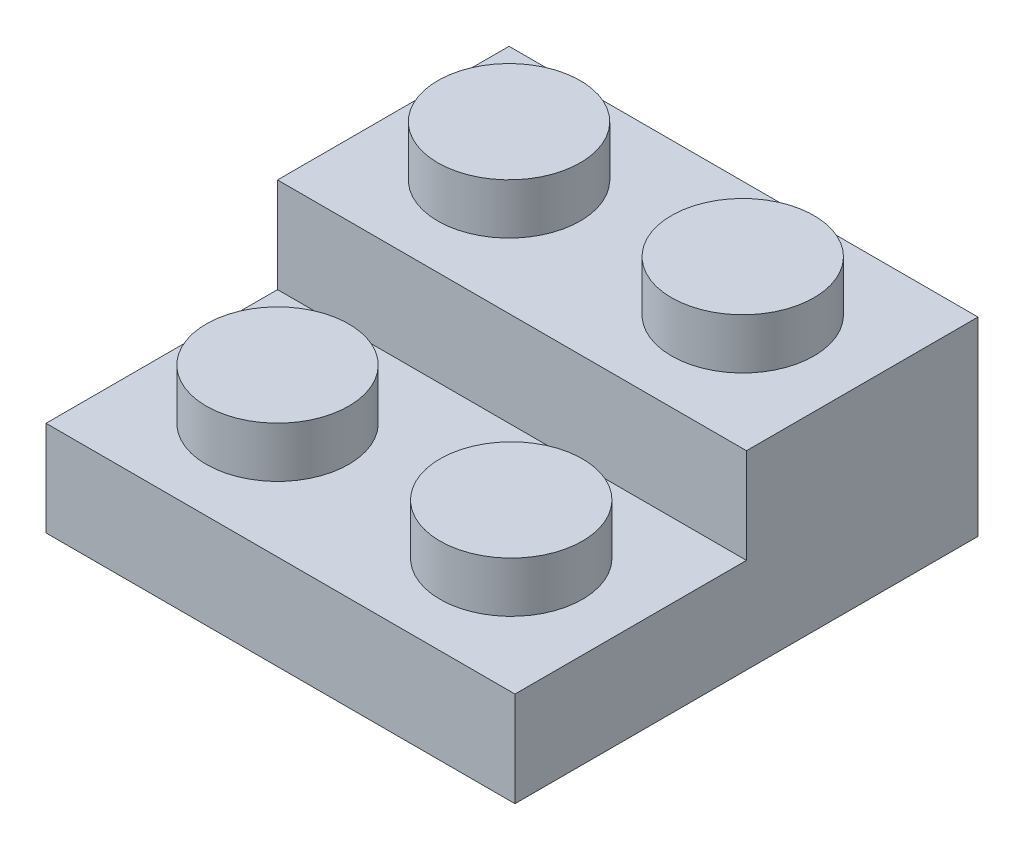
ISO-10303-21;
HEADER;
FILE_DESCRIPTION(('STEP AP214'),'2;1');
FILE_NAME('part.step','',(''),(''),'','','');
FILE_SCHEMA(('AUTOMOTIVE_DESIGN { 1 0 10303 214 1 1 1 1 }'));
ENDSEC;
DATA;
#1=APPLICATION_CONTEXT('core data for automotive mechanical design processes');
#2=APPLICATION_PROTOCOL_DEFINITION('international standard','automotive_design',2000,#1);
#3=PRODUCT_CONTEXT('',#1,'mechanical');
#4=PRODUCT('Part','Part','',(#3));
#5=PRODUCT_RELATED_PRODUCT_CATEGORY('part','',(#4));
#6=PRODUCT_DEFINITION_FORMATION('','',#4);
#7=PRODUCT_DEFINITION_CONTEXT('part definition',#1,'design');
#8=PRODUCT_DEFINITION('design','',#6,#7);
#9=PRODUCT_DEFINITION_SHAPE('','',#8);
#10=(LENGTH_UNIT() NAMED_UNIT(*) SI_UNIT(.MILLI.,.METRE.));
#11=(NAMED_UNIT(*) PLANE_ANGLE_UNIT() SI_UNIT($,.RADIAN.));
#12=(NAMED_UNIT(*) SI_UNIT($,.STERADIAN.) SOLID_ANGLE_UNIT());
#13=UNCERTAINTY_MEASURE_WITH_UNIT(LENGTH_MEASURE(1.E-05),#10,'distance_accuracy_value','');
#14=(GEOMETRIC_REPRESENTATION_CONTEXT(3) GLOBAL_UNCERTAINTY_ASSIGNED_CONTEXT((#13)) GLOBAL_UNIT_ASSIGNED_CONTEXT((#10,
#11,#12)) REPRESENTATION_CONTEXT('',''));
#15=CARTESIAN_POINT('',(0.,0.,0.));
#16=DIRECTION('',(0.,0.,1.));
#17=DIRECTION('',(1.,0.,0.));
#18=AXIS2_PLACEMENT_3D('',#15,#16,#17);
#19=CARTESIAN_POINT('',(-7.9,6.4,7.80000002100001));
#20=DIRECTION('',(1.,0.,0.));
#21=DIRECTION('',(0.,0.,-1.));
#22=AXIS2_PLACEMENT_3D('',#19,#20,#21);
#23=PLANE('',#22);
#24=DIRECTION('',(0.,1.,0.));
#25=VECTOR('',#24,1.);
#26=CARTESIAN_POINT('',(-7.9,3.2,0.));
#27=LINE('',#26,#25);
#28=CARTESIAN_POINT('',(-7.9,3.2,0.));
#29=VERTEX_POINT('',#28);
#30=CARTESIAN_POINT('',(-7.9,6.4,0.));
#31=VERTEX_POINT('',#30);
#32=EDGE_CURVE('E99',#29,#31,#27,.T.);
#33=ORIENTED_EDGE('',*,*,#32,.T.);
#34=DIRECTION('',(0.,0.,1.));
#35=VECTOR('',#34,1.);
#36=CARTESIAN_POINT('',(-7.9,6.4,7.80000002100001));
#37=LINE('',#36,#35);
#38=CARTESIAN_POINT('',(-7.9,6.4,-7.80000002099998));
#39=VERTEX_POINT('',#38);
#40=EDGE_CURVE('E84',#39,#31,#37,.T.);
#41=ORIENTED_EDGE('',*,*,#40,.F.);
#42=DIRECTION('',(0.,-1.,0.));
#43=VECTOR('',#42,1.);
#44=CARTESIAN_POINT('',(-7.9,6.4,-7.80000002099998));
#45=LINE('',#44,#43);
#46=CARTESIAN_POINT('',(-7.9,0.,-7.80000002099998));
#47=VERTEX_POINT('',#46);
#48=EDGE_CURVE('E77',#39,#47,#45,.T.);
#49=ORIENTED_EDGE('',*,*,#48,.T.);
#50=DIRECTION('',(0.,0.,1.));
#51=VECTOR('',#50,1.);
#52=CARTESIAN_POINT('',(-7.9,0.,7.80000002100001));
#53=LINE('',#52,#51);
#54=CARTESIAN_POINT('',(-7.9,0.,7.80000002100001));
#55=VERTEX_POINT('',#54);
#56=EDGE_CURVE('E91',#47,#55,#53,.T.);
#57=ORIENTED_EDGE('',*,*,#56,.T.);
#58=DIRECTION('',(0.,-1.,0.));
#59=VECTOR('',#58,1.);
#60=CARTESIAN_POINT('',(-7.9,6.4,7.80000002100001));
#61=LINE('',#60,#59);
#62=CARTESIAN_POINT('',(-7.9,3.2,7.80000002100001));
#63=VERTEX_POINT('',#62);
#64=EDGE_CURVE('E11',#63,#55,#61,.T.);
#65=ORIENTED_EDGE('',*,*,#64,.F.);
#66=DIRECTION('',(0.,0.,1.));
#67=VECTOR('',#66,1.);
#68=CARTESIAN_POINT('',(-7.9,3.2,0.));
#69=LINE('',#68,#67);
#70=EDGE_CURVE('E121',#29,#63,#69,.T.);
#71=ORIENTED_EDGE('',*,*,#70,.F.);
#72=EDGE_LOOP('',(#33,#41,#49,#57,#65,#71));
#73=FACE_BOUND('',#72,.T.);
#74=ADVANCED_FACE('F33',(#73),#23,.F.);
#75=CARTESIAN_POINT('',(7.9,6.4,7.80000002100001));
#76=DIRECTION('',(0.,0.,-1.));
#77=DIRECTION('',(-1.,0.,0.));
#78=AXIS2_PLACEMENT_3D('',#75,#76,#77);
#79=PLANE('',#78);
#80=DIRECTION('',(1.,0.,0.));
#81=VECTOR('',#80,1.);
#82=CARTESIAN_POINT('',(0.,3.2,7.80000002100001));
#83=LINE('',#82,#81);
#84=CARTESIAN_POINT('',(7.9,3.2,7.80000002100001));
#85=VERTEX_POINT('',#84);
#86=EDGE_CURVE('E117',#63,#85,#83,.T.);
#87=ORIENTED_EDGE('',*,*,#86,.F.);
#88=ORIENTED_EDGE('',*,*,#64,.T.);
#89=DIRECTION('',(1.,0.,0.));
#90=VECTOR('',#89,1.);
#91=CARTESIAN_POINT('',(7.9,0.,7.80000002100001));
#92=LINE('',#91,#90);
#93=CARTESIAN_POINT('',(7.9,0.,7.80000002100001));
#94=VERTEX_POINT('',#93);
#95=EDGE_CURVE('E96',#55,#94,#92,.T.);
#96=ORIENTED_EDGE('',*,*,#95,.T.);
#97=DIRECTION('',(0.,-1.,0.));
#98=VECTOR('',#97,1.);
#99=CARTESIAN_POINT('',(7.9,6.4,7.80000002100001));
#100=LINE('',#99,#98);
#101=EDGE_CURVE('E40',#85,#94,#100,.T.);
#102=ORIENTED_EDGE('',*,*,#101,.F.);
#103=EDGE_LOOP('',(#87,#88,#96,#102));
#104=FACE_BOUND('',#103,.T.);
#105=ADVANCED_FACE('F114',(#104),#79,.F.);
#106=CARTESIAN_POINT('',(7.9,6.4,7.80000002100001));
#107=DIRECTION('',(-1.,0.,0.));
#108=DIRECTION('',(0.,0.,1.));
#109=AXIS2_PLACEMENT_3D('',#106,#107,#108);
#110=PLANE('',#109);
#111=DIRECTION('',(0.,1.,0.));
#112=VECTOR('',#111,1.);
#113=CARTESIAN_POINT('',(7.9,3.2,0.));
#114=LINE('',#113,#112);
#115=CARTESIAN_POINT('',(7.9,3.2,0.));
#116=VERTEX_POINT('',#115);
#117=CARTESIAN_POINT('',(7.9,6.4,0.));
#118=VERTEX_POINT('',#117);
#119=EDGE_CURVE('E47',#116,#118,#114,.T.);
#120=ORIENTED_EDGE('',*,*,#119,.F.);
#121=DIRECTION('',(0.,0.,-1.));
#122=VECTOR('',#121,1.);
#123=CARTESIAN_POINT('',(7.9,3.2,0.));
#124=LINE('',#123,#122);
#125=EDGE_CURVE('E111',#85,#116,#124,.T.);
#126=ORIENTED_EDGE('',*,*,#125,.F.);
#127=ORIENTED_EDGE('',*,*,#101,.T.);
#128=DIRECTION('',(0.,0.,-1.));
#129=VECTOR('',#128,1.);
#130=CARTESIAN_POINT('',(7.9,0.,7.80000002100001));
#131=LINE('',#130,#129);
#132=CARTESIAN_POINT('',(7.9,0.,-7.80000002099998));
#133=VERTEX_POINT('',#132);
#134=EDGE_CURVE('E85',#94,#133,#131,.T.);
#135=ORIENTED_EDGE('',*,*,#134,.T.);
#136=DIRECTION('',(0.,-1.,0.));
#137=VECTOR('',#136,1.);
#138=CARTESIAN_POINT('',(7.9,6.4,-7.80000002099998));
#139=LINE('',#138,#137);
#140=CARTESIAN_POINT('',(7.9,6.4,-7.80000002099998));
#141=VERTEX_POINT('',#140);
#142=EDGE_CURVE('E80',#141,#133,#139,.T.);
#143=ORIENTED_EDGE('',*,*,#142,.F.);
#144=DIRECTION('',(0.,0.,-1.));
#145=VECTOR('',#144,1.);
#146=CARTESIAN_POINT('',(7.9,6.4,7.80000002100001));
#147=LINE('',#146,#145);
#148=EDGE_CURVE('E138',#118,#141,#147,.T.);
#149=ORIENTED_EDGE('',*,*,#148,.F.);
#150=EDGE_LOOP('',(#120,#126,#127,#135,#143,#149));
#151=FACE_BOUND('',#150,.T.);
#152=ADVANCED_FACE('F108',(#151),#110,.F.);
#153=CARTESIAN_POINT('',(0.,6.4,0.));
#154=DIRECTION('',(0.,1.,0.));
#155=DIRECTION('',(0.,0.,1.));
#156=AXIS2_PLACEMENT_3D('',#153,#154,#155);
#157=PLANE('',#156);
#158=CARTESIAN_POINT('',(-4.,6.4,-3.90000002099998));
#159=DIRECTION('',(0.,1.,0.));
#160=DIRECTION('',(0.,0.,1.));
#161=AXIS2_PLACEMENT_3D('',#158,#159,#160);
#162=CIRCLE('',#161,2.4);
#163=CARTESIAN_POINT('',(-4.,6.4,-1.50000002099998));
#164=VERTEX_POINT('',#163);
#165=EDGE_CURVE('E163',#164,#164,#162,.T.);
#166=ORIENTED_EDGE('',*,*,#165,.F.);
#167=EDGE_LOOP('',(#166));
#168=FACE_BOUND('',#167,.T.);
#169=CARTESIAN_POINT('',(3.874,6.4,-3.90000002099998));
#170=DIRECTION('',(0.,1.,0.));
#171=DIRECTION('',(0.,0.,1.));
#172=AXIS2_PLACEMENT_3D('',#169,#170,#171);
#173=CIRCLE('',#172,2.4);
#174=CARTESIAN_POINT('',(3.874,6.4,-1.50000002099998));
#175=VERTEX_POINT('',#174);
#176=EDGE_CURVE('E157',#175,#175,#173,.T.);
#177=ORIENTED_EDGE('',*,*,#176,.F.);
#178=EDGE_LOOP('',(#177));
#179=FACE_BOUND('',#178,.T.);
#180=ORIENTED_EDGE('',*,*,#40,.T.);
#181=DIRECTION('',(1.,0.,0.));
#182=VECTOR('',#181,1.);
#183=CARTESIAN_POINT('',(0.,6.4,0.));
#184=LINE('',#183,#182);
#185=EDGE_CURVE('E130',#31,#118,#184,.T.);
#186=ORIENTED_EDGE('',*,*,#185,.T.);
#187=ORIENTED_EDGE('',*,*,#148,.T.);
#188=DIRECTION('',(-1.,0.,0.));
#189=VECTOR('',#188,1.);
#190=CARTESIAN_POINT('',(7.9,6.4,-7.80000002099998));
#191=LINE('',#190,#189);
#192=EDGE_CURVE('E56',#141,#39,#191,.T.);
#193=ORIENTED_EDGE('',*,*,#192,.T.);
#194=EDGE_LOOP('',(#180,#186,#187,#193));
#195=FACE_BOUND('',#194,.T.);
#196=ADVANCED_FACE('F137',(#168,#179,#195),#157,.T.);
#197=CARTESIAN_POINT('',(7.9,6.4,-7.80000002099998));
#198=DIRECTION('',(0.,0.,1.));
#199=DIRECTION('',(1.,0.,0.));
#200=AXIS2_PLACEMENT_3D('',#197,#198,#199);
#201=PLANE('',#200);
#202=DIRECTION('',(-1.,0.,0.));
#203=VECTOR('',#202,1.);
#204=CARTESIAN_POINT('',(7.9,0.,-7.80000002099998));
#205=LINE('',#204,#203);
#206=EDGE_CURVE('E74',#133,#47,#205,.T.);
#207=ORIENTED_EDGE('',*,*,#206,.T.);
#208=ORIENTED_EDGE('',*,*,#48,.F.);
#209=ORIENTED_EDGE('',*,*,#192,.F.);
#210=ORIENTED_EDGE('',*,*,#142,.T.);
#211=EDGE_LOOP('',(#207,#208,#209,#210));
#212=FACE_BOUND('',#211,.T.);
#213=ADVANCED_FACE('F76',(#212),#201,.F.);
#214=CARTESIAN_POINT('',(0.,0.,0.));
#215=DIRECTION('',(0.,1.,0.));
#216=DIRECTION('',(0.,0.,1.));
#217=AXIS2_PLACEMENT_3D('',#214,#215,#216);
#218=PLANE('',#217);
#219=CARTESIAN_POINT('',(0.,0.,-3.93454978920842));
#220=DIRECTION('',(0.,-1.,0.));
#221=DIRECTION('',(0.,0.,-1.));
#222=AXIS2_PLACEMENT_3D('',#219,#220,#221);
#223=CIRCLE('',#222,2.5);
#224=CARTESIAN_POINT('',(0.,0.,-6.43454978920842));
#225=VERTEX_POINT('',#224);
#226=EDGE_CURVE('E175',#225,#225,#223,.T.);
#227=ORIENTED_EDGE('',*,*,#226,.F.);
#228=EDGE_LOOP('',(#227));
#229=FACE_BOUND('',#228,.T.);
#230=CARTESIAN_POINT('',(0.,0.,3.90000001050001));
#231=DIRECTION('',(0.,-1.,0.));
#232=DIRECTION('',(0.,0.,-1.));
#233=AXIS2_PLACEMENT_3D('',#230,#231,#232);
#234=CIRCLE('',#233,2.5);
#235=CARTESIAN_POINT('',(0.,0.,1.40000001050001));
#236=VERTEX_POINT('',#235);
#237=EDGE_CURVE('E169',#236,#236,#234,.T.);
#238=ORIENTED_EDGE('',*,*,#237,.F.);
#239=EDGE_LOOP('',(#238));
#240=FACE_BOUND('',#239,.T.);
#241=ORIENTED_EDGE('',*,*,#56,.F.);
#242=ORIENTED_EDGE('',*,*,#206,.F.);
#243=ORIENTED_EDGE('',*,*,#134,.F.);
#244=ORIENTED_EDGE('',*,*,#95,.F.);
#245=EDGE_LOOP('',(#241,#242,#243,#244));
#246=FACE_BOUND('',#245,.T.);
#247=ADVANCED_FACE('F94',(#229,#240,#246),#218,.F.);
#248=CARTESIAN_POINT('',(0.,3.2,0.));
#249=DIRECTION('',(0.,0.,1.));
#250=DIRECTION('',(1.,0.,0.));
#251=AXIS2_PLACEMENT_3D('',#248,#249,#250);
#252=PLANE('',#251);
#253=ORIENTED_EDGE('',*,*,#185,.F.);
#254=ORIENTED_EDGE('',*,*,#32,.F.);
#255=DIRECTION('',(1.,0.,0.));
#256=VECTOR('',#255,1.);
#257=CARTESIAN_POINT('',(0.,3.2,0.));
#258=LINE('',#257,#256);
#259=EDGE_CURVE('E133',#29,#116,#258,.T.);
#260=ORIENTED_EDGE('',*,*,#259,.T.);
#261=ORIENTED_EDGE('',*,*,#119,.T.);
#262=EDGE_LOOP('',(#253,#254,#260,#261));
#263=FACE_BOUND('',#262,.T.);
#264=ADVANCED_FACE('F131',(#263),#252,.T.);
#265=CARTESIAN_POINT('',(0.,3.2,0.));
#266=DIRECTION('',(0.,1.,0.));
#267=DIRECTION('',(0.,0.,1.));
#268=AXIS2_PLACEMENT_3D('',#265,#266,#267);
#269=PLANE('',#268);
#270=CARTESIAN_POINT('',(-4.,3.2,3.90000002100001));
#271=DIRECTION('',(0.,1.,0.));
#272=DIRECTION('',(0.,0.,1.));
#273=AXIS2_PLACEMENT_3D('',#270,#271,#272);
#274=CIRCLE('',#273,2.4000000030699);
#275=CARTESIAN_POINT('',(-4.,3.2,6.30000002406991));
#276=VERTEX_POINT('',#275);
#277=EDGE_CURVE('E151',#276,#276,#274,.T.);
#278=ORIENTED_EDGE('',*,*,#277,.F.);
#279=EDGE_LOOP('',(#278));
#280=FACE_BOUND('',#279,.T.);
#281=CARTESIAN_POINT('',(3.874,3.2,3.90000002100001));
#282=DIRECTION('',(0.,1.,0.));
#283=DIRECTION('',(0.,0.,1.));
#284=AXIS2_PLACEMENT_3D('',#281,#282,#283);
#285=CIRCLE('',#284,2.4000000030699);
#286=CARTESIAN_POINT('',(3.874,3.2,6.30000002406991));
#287=VERTEX_POINT('',#286);
#288=EDGE_CURVE('E145',#287,#287,#285,.T.);
#289=ORIENTED_EDGE('',*,*,#288,.F.);
#290=EDGE_LOOP('',(#289));
#291=FACE_BOUND('',#290,.T.);
#292=ORIENTED_EDGE('',*,*,#259,.F.);
#293=ORIENTED_EDGE('',*,*,#70,.T.);
#294=ORIENTED_EDGE('',*,*,#86,.T.);
#295=ORIENTED_EDGE('',*,*,#125,.T.);
#296=EDGE_LOOP('',(#292,#293,#294,#295));
#297=FACE_BOUND('',#296,.T.);
#298=ADVANCED_FACE('F226',(#280,#291,#297),#269,.T.);
#299=CARTESIAN_POINT('',(3.874,4.9,3.90000002100001));
#300=DIRECTION('',(0.,-1.,0.));
#301=DIRECTION('',(0.,0.,-1.));
#302=AXIS2_PLACEMENT_3D('',#299,#300,#301);
#303=CYLINDRICAL_SURFACE('',#302,2.4000000030699);
#304=CARTESIAN_POINT('',(3.874,4.9,3.90000002100001));
#305=DIRECTION('',(0.,1.,0.));
#306=DIRECTION('',(0.,0.,1.));
#307=AXIS2_PLACEMENT_3D('',#304,#305,#306);
#308=CIRCLE('',#307,2.4000000030699);
#309=CARTESIAN_POINT('',(3.874,4.9,6.30000002406991));
#310=VERTEX_POINT('',#309);
#311=EDGE_CURVE('E134',#310,#310,#308,.T.);
#312=ORIENTED_EDGE('',*,*,#311,.F.);
#313=EDGE_LOOP('',(#312));
#314=FACE_BOUND('',#313,.T.);
#315=ORIENTED_EDGE('',*,*,#288,.T.);
#316=EDGE_LOOP('',(#315));
#317=FACE_BOUND('',#316,.T.);
#318=ADVANCED_FACE('F229',(#314,#317),#303,.T.);
#319=CARTESIAN_POINT('',(3.874,4.9,3.90000002100001));
#320=DIRECTION('',(0.,1.,0.));
#321=DIRECTION('',(0.,0.,1.));
#322=AXIS2_PLACEMENT_3D('',#319,#320,#321);
#323=PLANE('',#322);
#324=ORIENTED_EDGE('',*,*,#311,.T.);
#325=EDGE_LOOP('',(#324));
#326=FACE_BOUND('',#325,.T.);
#327=ADVANCED_FACE('F233',(#326),#323,.T.);
#328=CARTESIAN_POINT('',(-4.,4.9,3.90000002100001));
#329=DIRECTION('',(0.,-1.,0.));
#330=DIRECTION('',(0.,0.,-1.));
#331=AXIS2_PLACEMENT_3D('',#328,#329,#330);
#332=CYLINDRICAL_SURFACE('',#331,2.4000000030699);
#333=CARTESIAN_POINT('',(-4.,4.9,3.90000002100001));
#334=DIRECTION('',(0.,1.,0.));
#335=DIRECTION('',(0.,0.,1.));
#336=AXIS2_PLACEMENT_3D('',#333,#334,#335);
#337=CIRCLE('',#336,2.4000000030699);
#338=CARTESIAN_POINT('',(-4.,4.9,6.30000002406991));
#339=VERTEX_POINT('',#338);
#340=EDGE_CURVE('E148',#339,#339,#337,.T.);
#341=ORIENTED_EDGE('',*,*,#340,.F.);
#342=EDGE_LOOP('',(#341));
#343=FACE_BOUND('',#342,.T.);
#344=ORIENTED_EDGE('',*,*,#277,.T.);
#345=EDGE_LOOP('',(#344));
#346=FACE_BOUND('',#345,.T.);
#347=ADVANCED_FACE('F237',(#343,#346),#332,.T.);
#348=CARTESIAN_POINT('',(-4.,4.9,3.90000002100001));
#349=DIRECTION('',(0.,1.,0.));
#350=DIRECTION('',(0.,0.,1.));
#351=AXIS2_PLACEMENT_3D('',#348,#349,#350);
#352=PLANE('',#351);
#353=ORIENTED_EDGE('',*,*,#340,.T.);
#354=EDGE_LOOP('',(#353));
#355=FACE_BOUND('',#354,.T.);
#356=ADVANCED_FACE('F241',(#355),#352,.T.);
#357=CARTESIAN_POINT('',(3.874,8.1,-3.90000002099998));
#358=DIRECTION('',(0.,-1.,0.));
#359=DIRECTION('',(0.,0.,-1.));
#360=AXIS2_PLACEMENT_3D('',#357,#358,#359);
#361=CYLINDRICAL_SURFACE('',#360,2.4);
#362=CARTESIAN_POINT('',(3.874,8.1,-3.90000002099998));
#363=DIRECTION('',(0.,1.,0.));
#364=DIRECTION('',(0.,0.,1.));
#365=AXIS2_PLACEMENT_3D('',#362,#363,#364);
#366=CIRCLE('',#365,2.4);
#367=CARTESIAN_POINT('',(3.874,8.1,-1.50000002099998));
#368=VERTEX_POINT('',#367);
#369=EDGE_CURVE('E154',#368,#368,#366,.T.);
#370=ORIENTED_EDGE('',*,*,#369,.F.);
#371=EDGE_LOOP('',(#370));
#372=FACE_BOUND('',#371,.T.);
#373=ORIENTED_EDGE('',*,*,#176,.T.);
#374=EDGE_LOOP('',(#373));
#375=FACE_BOUND('',#374,.T.);
#376=ADVANCED_FACE('F245',(#372,#375),#361,.T.);
#377=CARTESIAN_POINT('',(3.874,8.1,-3.90000002099998));
#378=DIRECTION('',(0.,1.,0.));
#379=DIRECTION('',(0.,0.,1.));
#380=AXIS2_PLACEMENT_3D('',#377,#378,#379);
#381=PLANE('',#380);
#382=ORIENTED_EDGE('',*,*,#369,.T.);
#383=EDGE_LOOP('',(#382));
#384=FACE_BOUND('',#383,.T.);
#385=ADVANCED_FACE('F249',(#384),#381,.T.);
#386=CARTESIAN_POINT('',(-4.,8.1,-3.90000002099998));
#387=DIRECTION('',(0.,-1.,0.));
#388=DIRECTION('',(0.,0.,-1.));
#389=AXIS2_PLACEMENT_3D('',#386,#387,#388);
#390=CYLINDRICAL_SURFACE('',#389,2.4);
#391=CARTESIAN_POINT('',(-4.,8.1,-3.90000002099998));
#392=DIRECTION('',(0.,1.,0.));
#393=DIRECTION('',(0.,0.,1.));
#394=AXIS2_PLACEMENT_3D('',#391,#392,#393);
#395=CIRCLE('',#394,2.4);
#396=CARTESIAN_POINT('',(-4.,8.1,-1.50000002099998));
#397=VERTEX_POINT('',#396);
#398=EDGE_CURVE('E160',#397,#397,#395,.T.);
#399=ORIENTED_EDGE('',*,*,#398,.F.);
#400=EDGE_LOOP('',(#399));
#401=FACE_BOUND('',#400,.T.);
#402=ORIENTED_EDGE('',*,*,#165,.T.);
#403=EDGE_LOOP('',(#402));
#404=FACE_BOUND('',#403,.T.);
#405=ADVANCED_FACE('F206',(#401,#404),#390,.T.);
#406=CARTESIAN_POINT('',(-4.,8.1,-3.90000002099998));
#407=DIRECTION('',(0.,1.,0.));
#408=DIRECTION('',(0.,0.,1.));
#409=AXIS2_PLACEMENT_3D('',#406,#407,#408);
#410=PLANE('',#409);
#411=ORIENTED_EDGE('',*,*,#398,.T.);
#412=EDGE_LOOP('',(#411));
#413=FACE_BOUND('',#412,.T.);
#414=ADVANCED_FACE('F197',(#413),#410,.T.);
#415=CARTESIAN_POINT('',(0.,1.8,3.90000001050001));
#416=DIRECTION('',(0.,-1.,0.));
#417=DIRECTION('',(0.,0.,-1.));
#418=AXIS2_PLACEMENT_3D('',#415,#416,#417);
#419=CYLINDRICAL_SURFACE('',#418,2.5);
#420=CARTESIAN_POINT('',(0.,1.8,3.90000001050001));
#421=DIRECTION('',(0.,-1.,0.));
#422=DIRECTION('',(0.,0.,-1.));
#423=AXIS2_PLACEMENT_3D('',#420,#421,#422);
#424=CIRCLE('',#423,2.5);
#425=CARTESIAN_POINT('',(0.,1.8,1.40000001050001));
#426=VERTEX_POINT('',#425);
#427=EDGE_CURVE('E166',#426,#426,#424,.T.);
#428=ORIENTED_EDGE('',*,*,#427,.F.);
#429=EDGE_LOOP('',(#428));
#430=FACE_BOUND('',#429,.T.);
#431=ORIENTED_EDGE('',*,*,#237,.T.);
#432=EDGE_LOOP('',(#431));
#433=FACE_BOUND('',#432,.T.);
#434=ADVANCED_FACE('F195',(#430,#433),#419,.F.);
#435=CARTESIAN_POINT('',(0.,1.8,0.));
#436=DIRECTION('',(0.,-1.,0.));
#437=DIRECTION('',(0.,0.,-1.));
#438=AXIS2_PLACEMENT_3D('',#435,#436,#437);
#439=PLANE('',#438);
#440=ORIENTED_EDGE('',*,*,#427,.T.);
#441=EDGE_LOOP('',(#440));
#442=FACE_BOUND('',#441,.T.);
#443=ADVANCED_FACE('F186',(#442),#439,.T.);
#444=CARTESIAN_POINT('',(0.,1.8,-3.93454978920842));
#445=DIRECTION('',(0.,-1.,0.));
#446=DIRECTION('',(0.,0.,-1.));
#447=AXIS2_PLACEMENT_3D('',#444,#445,#446);
#448=CYLINDRICAL_SURFACE('',#447,2.5);
#449=CARTESIAN_POINT('',(0.,1.8,-3.93454978920842));
#450=DIRECTION('',(0.,-1.,0.));
#451=DIRECTION('',(0.,0.,-1.));
#452=AXIS2_PLACEMENT_3D('',#449,#450,#451);
#453=CIRCLE('',#452,2.5);
#454=CARTESIAN_POINT('',(0.,1.8,-6.43454978920842));
#455=VERTEX_POINT('',#454);
#456=EDGE_CURVE('E172',#455,#455,#453,.T.);
#457=ORIENTED_EDGE('',*,*,#456,.F.);
#458=EDGE_LOOP('',(#457));
#459=FACE_BOUND('',#458,.T.);
#460=ORIENTED_EDGE('',*,*,#226,.T.);
#461=EDGE_LOOP('',(#460));
#462=FACE_BOUND('',#461,.T.);
#463=ADVANCED_FACE('F183',(#459,#462),#448,.F.);
#464=CARTESIAN_POINT('',(0.,1.8,-3.93454978920842));
#465=DIRECTION('',(0.,-1.,0.));
#466=DIRECTION('',(0.,0.,-1.));
#467=AXIS2_PLACEMENT_3D('',#464,#465,#466);
#468=PLANE('',#467);
#469=ORIENTED_EDGE('',*,*,#456,.T.);
#470=EDGE_LOOP('',(#469));
#471=FACE_BOUND('',#470,.T.);
#472=ADVANCED_FACE('F181',(#471),#468,.T.);
#473=CLOSED_SHELL('',(#74,#105,#152,#196,#213,#247,#264,#298,#318,#327,#347,#356,#376,#385,#405,
#414,#434,#443,#463,#472));
#474=MANIFOLD_SOLID_BREP('B2',#473);
#475=ADVANCED_BREP_SHAPE_REPRESENTATION('',(#18,#474),#14);
#476=SHAPE_DEFINITION_REPRESENTATION(#9,#475);
ENDSEC;
END-ISO-10303-21;
